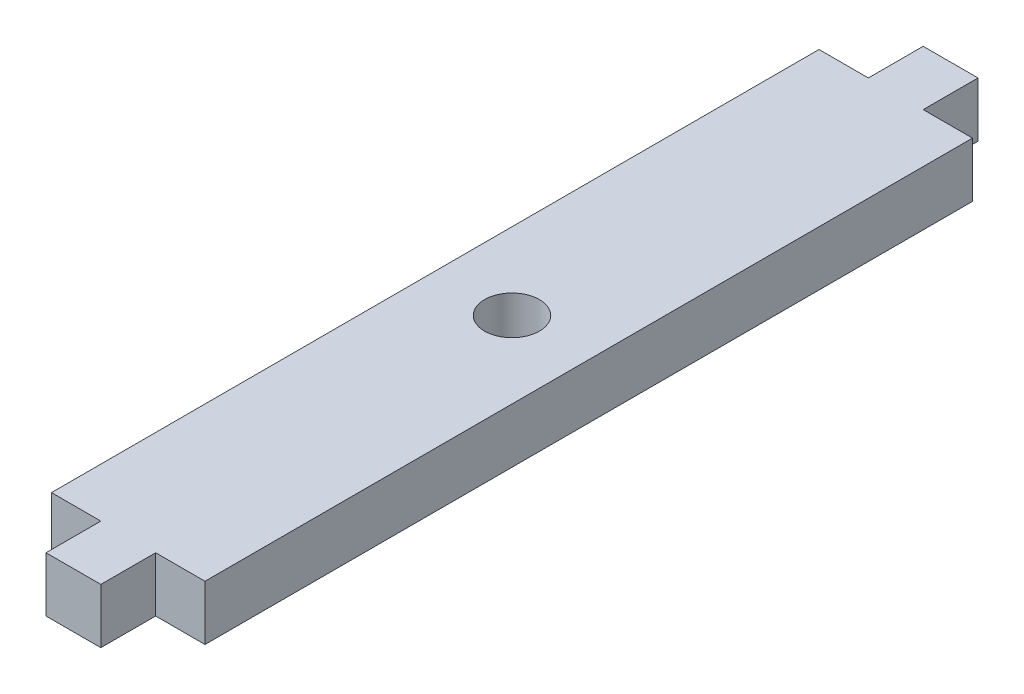
ISO-10303-21;
HEADER;
FILE_DESCRIPTION(('STEP AP214'),'2;1');
FILE_NAME('part.step','',(''),(''),'','','');
FILE_SCHEMA(('AUTOMOTIVE_DESIGN { 1 0 10303 214 1 1 1 1 }'));
ENDSEC;
DATA;
#1=APPLICATION_CONTEXT('core data for automotive mechanical design processes');
#2=APPLICATION_PROTOCOL_DEFINITION('international standard','automotive_design',2000,#1);
#3=PRODUCT_CONTEXT('',#1,'mechanical');
#4=PRODUCT('Part','Part','',(#3));
#5=PRODUCT_RELATED_PRODUCT_CATEGORY('part','',(#4));
#6=PRODUCT_DEFINITION_FORMATION('','',#4);
#7=PRODUCT_DEFINITION_CONTEXT('part definition',#1,'design');
#8=PRODUCT_DEFINITION('design','',#6,#7);
#9=PRODUCT_DEFINITION_SHAPE('','',#8);
#10=(LENGTH_UNIT() NAMED_UNIT(*) SI_UNIT(.MILLI.,.METRE.));
#11=(NAMED_UNIT(*) PLANE_ANGLE_UNIT() SI_UNIT($,.RADIAN.));
#12=(NAMED_UNIT(*) SI_UNIT($,.STERADIAN.) SOLID_ANGLE_UNIT());
#13=UNCERTAINTY_MEASURE_WITH_UNIT(LENGTH_MEASURE(1.E-05),#10,'distance_accuracy_value','');
#14=(GEOMETRIC_REPRESENTATION_CONTEXT(3) GLOBAL_UNCERTAINTY_ASSIGNED_CONTEXT((#13)) GLOBAL_UNIT_ASSIGNED_CONTEXT((#10,
#11,#12)) REPRESENTATION_CONTEXT('',''));
#15=CARTESIAN_POINT('',(0.,0.,0.));
#16=DIRECTION('',(0.,0.,1.));
#17=DIRECTION('',(1.,0.,0.));
#18=AXIS2_PLACEMENT_3D('',#15,#16,#17);
#19=CARTESIAN_POINT('',(0.,6.35,0.));
#20=DIRECTION('',(0.,1.,0.));
#21=DIRECTION('',(0.,0.,1.));
#22=AXIS2_PLACEMENT_3D('',#19,#20,#21);
#23=PLANE('',#22);
#24=DIRECTION('',(0.,0.,-1.));
#25=VECTOR('',#24,1.);
#26=CARTESIAN_POINT('',(0.,6.35,0.));
#27=LINE('',#26,#25);
#28=CARTESIAN_POINT('',(0.,6.35,71.12));
#29=VERTEX_POINT('',#28);
#30=CARTESIAN_POINT('',(0.,6.35,-17.78));
#31=VERTEX_POINT('',#30);
#32=EDGE_CURVE('E57',#29,#31,#27,.T.);
#33=ORIENTED_EDGE('',*,*,#32,.T.);
#34=DIRECTION('',(-1.,0.,0.));
#35=VECTOR('',#34,1.);
#36=CARTESIAN_POINT('',(0.,6.35,-17.78));
#37=LINE('',#36,#35);
#38=CARTESIAN_POINT('',(-5.715,6.35,-17.78));
#39=VERTEX_POINT('',#38);
#40=EDGE_CURVE('E285',#31,#39,#37,.T.);
#41=ORIENTED_EDGE('',*,*,#40,.T.);
#42=DIRECTION('',(0.,0.,-1.));
#43=VECTOR('',#42,1.);
#44=CARTESIAN_POINT('',(-5.715,6.35,-17.78));
#45=LINE('',#44,#43);
#46=CARTESIAN_POINT('',(-5.715,6.35,-24.13));
#47=VERTEX_POINT('',#46);
#48=EDGE_CURVE('E237',#39,#47,#45,.T.);
#49=ORIENTED_EDGE('',*,*,#48,.T.);
#50=DIRECTION('',(-1.,0.,0.));
#51=VECTOR('',#50,1.);
#52=CARTESIAN_POINT('',(-5.715,6.35,-24.13));
#53=LINE('',#52,#51);
#54=CARTESIAN_POINT('',(-12.065,6.35,-24.13));
#55=VERTEX_POINT('',#54);
#56=EDGE_CURVE('E260',#47,#55,#53,.T.);
#57=ORIENTED_EDGE('',*,*,#56,.T.);
#58=DIRECTION('',(0.,0.,1.));
#59=VECTOR('',#58,1.);
#60=CARTESIAN_POINT('',(-12.065,6.35,-24.13));
#61=LINE('',#60,#59);
#62=CARTESIAN_POINT('',(-12.065,6.35,-17.78));
#63=VERTEX_POINT('',#62);
#64=EDGE_CURVE('E256',#55,#63,#61,.T.);
#65=ORIENTED_EDGE('',*,*,#64,.T.);
#66=DIRECTION('',(-1.,0.,0.));
#67=VECTOR('',#66,1.);
#68=CARTESIAN_POINT('',(-12.065,6.35,-17.78));
#69=LINE('',#68,#67);
#70=CARTESIAN_POINT('',(-17.78,6.35,-17.78));
#71=VERTEX_POINT('',#70);
#72=EDGE_CURVE('E259',#63,#71,#69,.T.);
#73=ORIENTED_EDGE('',*,*,#72,.T.);
#74=DIRECTION('',(0.,0.,1.));
#75=VECTOR('',#74,1.);
#76=CARTESIAN_POINT('',(-17.78,6.35,-17.78));
#77=LINE('',#76,#75);
#78=CARTESIAN_POINT('',(-17.78,6.35,71.12));
#79=VERTEX_POINT('',#78);
#80=EDGE_CURVE('E264',#71,#79,#77,.T.);
#81=ORIENTED_EDGE('',*,*,#80,.T.);
#82=DIRECTION('',(1.,0.,0.));
#83=VECTOR('',#82,1.);
#84=CARTESIAN_POINT('',(-17.78,6.35,71.12));
#85=LINE('',#84,#83);
#86=CARTESIAN_POINT('',(-12.065,6.35,71.12));
#87=VERTEX_POINT('',#86);
#88=EDGE_CURVE('E271',#79,#87,#85,.T.);
#89=ORIENTED_EDGE('',*,*,#88,.T.);
#90=DIRECTION('',(0.,0.,1.));
#91=VECTOR('',#90,1.);
#92=CARTESIAN_POINT('',(-12.065,6.35,71.12));
#93=LINE('',#92,#91);
#94=CARTESIAN_POINT('',(-12.065,6.35,77.47));
#95=VERTEX_POINT('',#94);
#96=EDGE_CURVE('E141',#87,#95,#93,.T.);
#97=ORIENTED_EDGE('',*,*,#96,.T.);
#98=DIRECTION('',(1.,0.,0.));
#99=VECTOR('',#98,1.);
#100=CARTESIAN_POINT('',(-12.065,6.35,77.47));
#101=LINE('',#100,#99);
#102=CARTESIAN_POINT('',(-5.715,6.35,77.47));
#103=VERTEX_POINT('',#102);
#104=EDGE_CURVE('E135',#95,#103,#101,.T.);
#105=ORIENTED_EDGE('',*,*,#104,.T.);
#106=DIRECTION('',(0.,0.,-1.));
#107=VECTOR('',#106,1.);
#108=CARTESIAN_POINT('',(-5.715,6.35,77.47));
#109=LINE('',#108,#107);
#110=CARTESIAN_POINT('',(-5.715,6.35,71.12));
#111=VERTEX_POINT('',#110);
#112=EDGE_CURVE('E139',#103,#111,#109,.T.);
#113=ORIENTED_EDGE('',*,*,#112,.T.);
#114=DIRECTION('',(1.,0.,0.));
#115=VECTOR('',#114,1.);
#116=CARTESIAN_POINT('',(-5.715,6.35,71.12));
#117=LINE('',#116,#115);
#118=EDGE_CURVE('E158',#111,#29,#117,.T.);
#119=ORIENTED_EDGE('',*,*,#118,.T.);
#120=EDGE_LOOP('',(#33,#41,#49,#57,#65,#73,#81,#89,#97,#105,#113,#119));
#121=FACE_BOUND('',#120,.T.);
#122=CARTESIAN_POINT('',(-8.89,6.35,26.67));
#123=DIRECTION('',(0.,1.,0.));
#124=DIRECTION('',(0.,0.,1.));
#125=AXIS2_PLACEMENT_3D('',#122,#123,#124);
#126=CIRCLE('',#125,3.175);
#127=CARTESIAN_POINT('',(-8.89,6.35,29.845));
#128=VERTEX_POINT('',#127);
#129=EDGE_CURVE('E169',#128,#128,#126,.T.);
#130=ORIENTED_EDGE('',*,*,#129,.F.);
#131=EDGE_LOOP('',(#130));
#132=FACE_BOUND('',#131,.T.);
#133=ADVANCED_FACE('F39',(#121,#132),#23,.T.);
#134=CARTESIAN_POINT('',(0.,0.,0.));
#135=DIRECTION('',(0.,1.,0.));
#136=DIRECTION('',(0.,0.,1.));
#137=AXIS2_PLACEMENT_3D('',#134,#135,#136);
#138=PLANE('',#137);
#139=DIRECTION('',(-1.,0.,0.));
#140=VECTOR('',#139,1.);
#141=CARTESIAN_POINT('',(0.,0.,-17.78));
#142=LINE('',#141,#140);
#143=CARTESIAN_POINT('',(0.,0.,-17.78));
#144=VERTEX_POINT('',#143);
#145=CARTESIAN_POINT('',(-5.715,0.,-17.78));
#146=VERTEX_POINT('',#145);
#147=EDGE_CURVE('E165',#144,#146,#142,.T.);
#148=ORIENTED_EDGE('',*,*,#147,.F.);
#149=DIRECTION('',(0.,0.,-1.));
#150=VECTOR('',#149,1.);
#151=CARTESIAN_POINT('',(0.,0.,71.12));
#152=LINE('',#151,#150);
#153=CARTESIAN_POINT('',(0.,0.,71.12));
#154=VERTEX_POINT('',#153);
#155=EDGE_CURVE('E197',#154,#144,#152,.T.);
#156=ORIENTED_EDGE('',*,*,#155,.F.);
#157=DIRECTION('',(1.,0.,0.));
#158=VECTOR('',#157,1.);
#159=CARTESIAN_POINT('',(-5.715,0.,71.12));
#160=LINE('',#159,#158);
#161=CARTESIAN_POINT('',(-5.715,0.,71.12));
#162=VERTEX_POINT('',#161);
#163=EDGE_CURVE('E106',#162,#154,#160,.T.);
#164=ORIENTED_EDGE('',*,*,#163,.F.);
#165=DIRECTION('',(0.,0.,-1.));
#166=VECTOR('',#165,1.);
#167=CARTESIAN_POINT('',(-5.715,0.,77.47));
#168=LINE('',#167,#166);
#169=CARTESIAN_POINT('',(-5.715,0.,77.47));
#170=VERTEX_POINT('',#169);
#171=EDGE_CURVE('E99',#170,#162,#168,.T.);
#172=ORIENTED_EDGE('',*,*,#171,.F.);
#173=DIRECTION('',(1.,0.,0.));
#174=VECTOR('',#173,1.);
#175=CARTESIAN_POINT('',(-12.065,0.,77.47));
#176=LINE('',#175,#174);
#177=CARTESIAN_POINT('',(-12.065,0.,77.47));
#178=VERTEX_POINT('',#177);
#179=EDGE_CURVE('E150',#178,#170,#176,.T.);
#180=ORIENTED_EDGE('',*,*,#179,.F.);
#181=DIRECTION('',(0.,0.,1.));
#182=VECTOR('',#181,1.);
#183=CARTESIAN_POINT('',(-12.065,0.,71.12));
#184=LINE('',#183,#182);
#185=CARTESIAN_POINT('',(-12.065,0.,71.12));
#186=VERTEX_POINT('',#185);
#187=EDGE_CURVE('E188',#186,#178,#184,.T.);
#188=ORIENTED_EDGE('',*,*,#187,.F.);
#189=DIRECTION('',(1.,0.,0.));
#190=VECTOR('',#189,1.);
#191=CARTESIAN_POINT('',(-17.78,0.,71.12));
#192=LINE('',#191,#190);
#193=CARTESIAN_POINT('',(-17.78,0.,71.12));
#194=VERTEX_POINT('',#193);
#195=EDGE_CURVE('E185',#194,#186,#192,.T.);
#196=ORIENTED_EDGE('',*,*,#195,.F.);
#197=DIRECTION('',(0.,0.,1.));
#198=VECTOR('',#197,1.);
#199=CARTESIAN_POINT('',(-17.78,0.,53.34));
#200=LINE('',#199,#198);
#201=CARTESIAN_POINT('',(-17.78,0.,-17.78));
#202=VERTEX_POINT('',#201);
#203=EDGE_CURVE('E182',#202,#194,#200,.T.);
#204=ORIENTED_EDGE('',*,*,#203,.F.);
#205=DIRECTION('',(-1.,0.,0.));
#206=VECTOR('',#205,1.);
#207=CARTESIAN_POINT('',(-12.065,0.,-17.78));
#208=LINE('',#207,#206);
#209=CARTESIAN_POINT('',(-12.065,0.,-17.78));
#210=VERTEX_POINT('',#209);
#211=EDGE_CURVE('E178',#210,#202,#208,.T.);
#212=ORIENTED_EDGE('',*,*,#211,.F.);
#213=DIRECTION('',(0.,0.,1.));
#214=VECTOR('',#213,1.);
#215=CARTESIAN_POINT('',(-12.065,0.,-24.13));
#216=LINE('',#215,#214);
#217=CARTESIAN_POINT('',(-12.065,0.,-24.13));
#218=VERTEX_POINT('',#217);
#219=EDGE_CURVE('E175',#218,#210,#216,.T.);
#220=ORIENTED_EDGE('',*,*,#219,.F.);
#221=DIRECTION('',(-1.,0.,0.));
#222=VECTOR('',#221,1.);
#223=CARTESIAN_POINT('',(-5.715,0.,-24.13));
#224=LINE('',#223,#222);
#225=CARTESIAN_POINT('',(-5.715,0.,-24.13));
#226=VERTEX_POINT('',#225);
#227=EDGE_CURVE('E172',#226,#218,#224,.T.);
#228=ORIENTED_EDGE('',*,*,#227,.F.);
#229=DIRECTION('',(0.,0.,-1.));
#230=VECTOR('',#229,1.);
#231=CARTESIAN_POINT('',(-5.715,0.,-17.78));
#232=LINE('',#231,#230);
#233=EDGE_CURVE('E168',#146,#226,#232,.T.);
#234=ORIENTED_EDGE('',*,*,#233,.F.);
#235=EDGE_LOOP('',(#148,#156,#164,#172,#180,#188,#196,#204,#212,#220,#228,#234));
#236=FACE_BOUND('',#235,.T.);
#237=CARTESIAN_POINT('',(-8.89,0.,26.67));
#238=DIRECTION('',(0.,1.,0.));
#239=DIRECTION('',(0.,0.,1.));
#240=AXIS2_PLACEMENT_3D('',#237,#238,#239);
#241=CIRCLE('',#240,3.175);
#242=CARTESIAN_POINT('',(-8.89,0.,29.845));
#243=VERTEX_POINT('',#242);
#244=EDGE_CURVE('E292',#243,#243,#241,.T.);
#245=ORIENTED_EDGE('',*,*,#244,.T.);
#246=EDGE_LOOP('',(#245));
#247=FACE_BOUND('',#246,.T.);
#248=ADVANCED_FACE('F243',(#236,#247),#138,.F.);
#249=CARTESIAN_POINT('',(0.,6.35,-17.78));
#250=DIRECTION('',(0.,0.,1.));
#251=DIRECTION('',(1.,0.,0.));
#252=AXIS2_PLACEMENT_3D('',#249,#250,#251);
#253=PLANE('',#252);
#254=ORIENTED_EDGE('',*,*,#147,.T.);
#255=DIRECTION('',(0.,-1.,0.));
#256=VECTOR('',#255,1.);
#257=CARTESIAN_POINT('',(-5.715,6.35,-17.78));
#258=LINE('',#257,#256);
#259=EDGE_CURVE('E49',#39,#146,#258,.T.);
#260=ORIENTED_EDGE('',*,*,#259,.F.);
#261=ORIENTED_EDGE('',*,*,#40,.F.);
#262=DIRECTION('',(0.,-1.,0.));
#263=VECTOR('',#262,1.);
#264=CARTESIAN_POINT('',(0.,6.35,-17.78));
#265=LINE('',#264,#263);
#266=EDGE_CURVE('E11',#31,#144,#265,.T.);
#267=ORIENTED_EDGE('',*,*,#266,.T.);
#268=EDGE_LOOP('',(#254,#260,#261,#267));
#269=FACE_BOUND('',#268,.T.);
#270=ADVANCED_FACE('F41',(#269),#253,.F.);
#271=CARTESIAN_POINT('',(-5.715,6.35,-17.78));
#272=DIRECTION('',(-1.,0.,0.));
#273=DIRECTION('',(0.,0.,1.));
#274=AXIS2_PLACEMENT_3D('',#271,#272,#273);
#275=PLANE('',#274);
#276=ORIENTED_EDGE('',*,*,#233,.T.);
#277=DIRECTION('',(0.,-1.,0.));
#278=VECTOR('',#277,1.);
#279=CARTESIAN_POINT('',(-5.715,6.35,-24.13));
#280=LINE('',#279,#278);
#281=EDGE_CURVE('E226',#47,#226,#280,.T.);
#282=ORIENTED_EDGE('',*,*,#281,.F.);
#283=ORIENTED_EDGE('',*,*,#48,.F.);
#284=ORIENTED_EDGE('',*,*,#259,.T.);
#285=EDGE_LOOP('',(#276,#282,#283,#284));
#286=FACE_BOUND('',#285,.T.);
#287=ADVANCED_FACE('F235',(#286),#275,.F.);
#288=CARTESIAN_POINT('',(-5.715,6.35,-24.13));
#289=DIRECTION('',(0.,0.,1.));
#290=DIRECTION('',(1.,0.,0.));
#291=AXIS2_PLACEMENT_3D('',#288,#289,#290);
#292=PLANE('',#291);
#293=ORIENTED_EDGE('',*,*,#227,.T.);
#294=DIRECTION('',(0.,-1.,0.));
#295=VECTOR('',#294,1.);
#296=CARTESIAN_POINT('',(-12.065,6.35,-24.13));
#297=LINE('',#296,#295);
#298=EDGE_CURVE('E222',#55,#218,#297,.T.);
#299=ORIENTED_EDGE('',*,*,#298,.F.);
#300=ORIENTED_EDGE('',*,*,#56,.F.);
#301=ORIENTED_EDGE('',*,*,#281,.T.);
#302=EDGE_LOOP('',(#293,#299,#300,#301));
#303=FACE_BOUND('',#302,.T.);
#304=ADVANCED_FACE('F250',(#303),#292,.F.);
#305=CARTESIAN_POINT('',(-12.065,6.35,-24.13));
#306=DIRECTION('',(1.,0.,0.));
#307=DIRECTION('',(0.,0.,-1.));
#308=AXIS2_PLACEMENT_3D('',#305,#306,#307);
#309=PLANE('',#308);
#310=ORIENTED_EDGE('',*,*,#219,.T.);
#311=DIRECTION('',(0.,-1.,0.));
#312=VECTOR('',#311,1.);
#313=CARTESIAN_POINT('',(-12.065,6.35,-17.78));
#314=LINE('',#313,#312);
#315=EDGE_CURVE('E218',#63,#210,#314,.T.);
#316=ORIENTED_EDGE('',*,*,#315,.F.);
#317=ORIENTED_EDGE('',*,*,#64,.F.);
#318=ORIENTED_EDGE('',*,*,#298,.T.);
#319=EDGE_LOOP('',(#310,#316,#317,#318));
#320=FACE_BOUND('',#319,.T.);
#321=ADVANCED_FACE('F254',(#320),#309,.F.);
#322=CARTESIAN_POINT('',(-12.065,6.35,-17.78));
#323=DIRECTION('',(0.,0.,1.));
#324=DIRECTION('',(1.,0.,0.));
#325=AXIS2_PLACEMENT_3D('',#322,#323,#324);
#326=PLANE('',#325);
#327=ORIENTED_EDGE('',*,*,#211,.T.);
#328=DIRECTION('',(0.,-1.,0.));
#329=VECTOR('',#328,1.);
#330=CARTESIAN_POINT('',(-17.78,6.35,-17.78));
#331=LINE('',#330,#329);
#332=EDGE_CURVE('E214',#71,#202,#331,.T.);
#333=ORIENTED_EDGE('',*,*,#332,.F.);
#334=ORIENTED_EDGE('',*,*,#72,.F.);
#335=ORIENTED_EDGE('',*,*,#315,.T.);
#336=EDGE_LOOP('',(#327,#333,#334,#335));
#337=FACE_BOUND('',#336,.T.);
#338=ADVANCED_FACE('F326',(#337),#326,.F.);
#339=CARTESIAN_POINT('',(-17.78,6.35,53.34));
#340=DIRECTION('',(1.,0.,0.));
#341=DIRECTION('',(0.,0.,-1.));
#342=AXIS2_PLACEMENT_3D('',#339,#340,#341);
#343=PLANE('',#342);
#344=ORIENTED_EDGE('',*,*,#203,.T.);
#345=DIRECTION('',(0.,-1.,0.));
#346=VECTOR('',#345,1.);
#347=CARTESIAN_POINT('',(-17.78,6.35,71.12));
#348=LINE('',#347,#346);
#349=EDGE_CURVE('E210',#79,#194,#348,.T.);
#350=ORIENTED_EDGE('',*,*,#349,.F.);
#351=ORIENTED_EDGE('',*,*,#80,.F.);
#352=ORIENTED_EDGE('',*,*,#332,.T.);
#353=EDGE_LOOP('',(#344,#350,#351,#352));
#354=FACE_BOUND('',#353,.T.);
#355=ADVANCED_FACE('F323',(#354),#343,.F.);
#356=CARTESIAN_POINT('',(-17.78,6.35,71.12));
#357=DIRECTION('',(0.,0.,-1.));
#358=DIRECTION('',(-1.,0.,0.));
#359=AXIS2_PLACEMENT_3D('',#356,#357,#358);
#360=PLANE('',#359);
#361=ORIENTED_EDGE('',*,*,#195,.T.);
#362=DIRECTION('',(0.,-1.,0.));
#363=VECTOR('',#362,1.);
#364=CARTESIAN_POINT('',(-12.065,6.35,71.12));
#365=LINE('',#364,#363);
#366=EDGE_CURVE('E206',#87,#186,#365,.T.);
#367=ORIENTED_EDGE('',*,*,#366,.F.);
#368=ORIENTED_EDGE('',*,*,#88,.F.);
#369=ORIENTED_EDGE('',*,*,#349,.T.);
#370=EDGE_LOOP('',(#361,#367,#368,#369));
#371=FACE_BOUND('',#370,.T.);
#372=ADVANCED_FACE('F279',(#371),#360,.F.);
#373=CARTESIAN_POINT('',(-12.065,6.35,71.12));
#374=DIRECTION('',(1.,0.,0.));
#375=DIRECTION('',(0.,0.,-1.));
#376=AXIS2_PLACEMENT_3D('',#373,#374,#375);
#377=PLANE('',#376);
#378=ORIENTED_EDGE('',*,*,#187,.T.);
#379=DIRECTION('',(0.,-1.,0.));
#380=VECTOR('',#379,1.);
#381=CARTESIAN_POINT('',(-12.065,6.35,77.47));
#382=LINE('',#381,#380);
#383=EDGE_CURVE('E152',#95,#178,#382,.T.);
#384=ORIENTED_EDGE('',*,*,#383,.F.);
#385=ORIENTED_EDGE('',*,*,#96,.F.);
#386=ORIENTED_EDGE('',*,*,#366,.T.);
#387=EDGE_LOOP('',(#378,#384,#385,#386));
#388=FACE_BOUND('',#387,.T.);
#389=ADVANCED_FACE('F283',(#388),#377,.F.);
#390=CARTESIAN_POINT('',(-12.065,6.35,77.47));
#391=DIRECTION('',(0.,0.,-1.));
#392=DIRECTION('',(-1.,0.,0.));
#393=AXIS2_PLACEMENT_3D('',#390,#391,#392);
#394=PLANE('',#393);
#395=ORIENTED_EDGE('',*,*,#179,.T.);
#396=DIRECTION('',(0.,-1.,0.));
#397=VECTOR('',#396,1.);
#398=CARTESIAN_POINT('',(-5.715,6.35,77.47));
#399=LINE('',#398,#397);
#400=EDGE_CURVE('E147',#103,#170,#399,.T.);
#401=ORIENTED_EDGE('',*,*,#400,.F.);
#402=ORIENTED_EDGE('',*,*,#104,.F.);
#403=ORIENTED_EDGE('',*,*,#383,.T.);
#404=EDGE_LOOP('',(#395,#401,#402,#403));
#405=FACE_BOUND('',#404,.T.);
#406=ADVANCED_FACE('F148',(#405),#394,.F.);
#407=CARTESIAN_POINT('',(-5.715,6.35,77.47));
#408=DIRECTION('',(-1.,0.,0.));
#409=DIRECTION('',(0.,0.,1.));
#410=AXIS2_PLACEMENT_3D('',#407,#408,#409);
#411=PLANE('',#410);
#412=ORIENTED_EDGE('',*,*,#171,.T.);
#413=DIRECTION('',(0.,-1.,0.));
#414=VECTOR('',#413,1.);
#415=CARTESIAN_POINT('',(-5.715,6.35,71.12));
#416=LINE('',#415,#414);
#417=EDGE_CURVE('E153',#111,#162,#416,.T.);
#418=ORIENTED_EDGE('',*,*,#417,.F.);
#419=ORIENTED_EDGE('',*,*,#112,.F.);
#420=ORIENTED_EDGE('',*,*,#400,.T.);
#421=EDGE_LOOP('',(#412,#418,#419,#420));
#422=FACE_BOUND('',#421,.T.);
#423=ADVANCED_FACE('F155',(#422),#411,.F.);
#424=CARTESIAN_POINT('',(-5.715,6.35,71.12));
#425=DIRECTION('',(0.,0.,-1.));
#426=DIRECTION('',(-1.,0.,0.));
#427=AXIS2_PLACEMENT_3D('',#424,#425,#426);
#428=PLANE('',#427);
#429=ORIENTED_EDGE('',*,*,#163,.T.);
#430=DIRECTION('',(0.,-1.,0.));
#431=VECTOR('',#430,1.);
#432=CARTESIAN_POINT('',(0.,6.35,71.12));
#433=LINE('',#432,#431);
#434=EDGE_CURVE('E161',#29,#154,#433,.T.);
#435=ORIENTED_EDGE('',*,*,#434,.F.);
#436=ORIENTED_EDGE('',*,*,#118,.F.);
#437=ORIENTED_EDGE('',*,*,#417,.T.);
#438=EDGE_LOOP('',(#429,#435,#436,#437));
#439=FACE_BOUND('',#438,.T.);
#440=ADVANCED_FACE('F312',(#439),#428,.F.);
#441=CARTESIAN_POINT('',(0.,6.35,71.12));
#442=DIRECTION('',(-1.,0.,0.));
#443=DIRECTION('',(0.,0.,1.));
#444=AXIS2_PLACEMENT_3D('',#441,#442,#443);
#445=PLANE('',#444);
#446=ORIENTED_EDGE('',*,*,#155,.T.);
#447=ORIENTED_EDGE('',*,*,#266,.F.);
#448=ORIENTED_EDGE('',*,*,#32,.F.);
#449=ORIENTED_EDGE('',*,*,#434,.T.);
#450=EDGE_LOOP('',(#446,#447,#448,#449));
#451=FACE_BOUND('',#450,.T.);
#452=ADVANCED_FACE('F284',(#451),#445,.F.);
#453=CARTESIAN_POINT('',(-8.89,6.35,26.67));
#454=DIRECTION('',(0.,-1.,0.));
#455=DIRECTION('',(0.,0.,-1.));
#456=AXIS2_PLACEMENT_3D('',#453,#454,#455);
#457=CYLINDRICAL_SURFACE('',#456,3.175);
#458=ORIENTED_EDGE('',*,*,#129,.T.);
#459=EDGE_LOOP('',(#458));
#460=FACE_BOUND('',#459,.T.);
#461=ORIENTED_EDGE('',*,*,#244,.F.);
#462=EDGE_LOOP('',(#461));
#463=FACE_BOUND('',#462,.T.);
#464=ADVANCED_FACE('F300',(#460,#463),#457,.F.);
#465=CLOSED_SHELL('',(#133,#248,#270,#287,#304,#321,#338,#355,#372,#389,#406,#423,#440,#452,#464));
#466=MANIFOLD_SOLID_BREP('B2',#465);
#467=ADVANCED_BREP_SHAPE_REPRESENTATION('',(#18,#466),#14);
#468=SHAPE_DEFINITION_REPRESENTATION(#9,#467);
ENDSEC;
END-ISO-10303-21;
